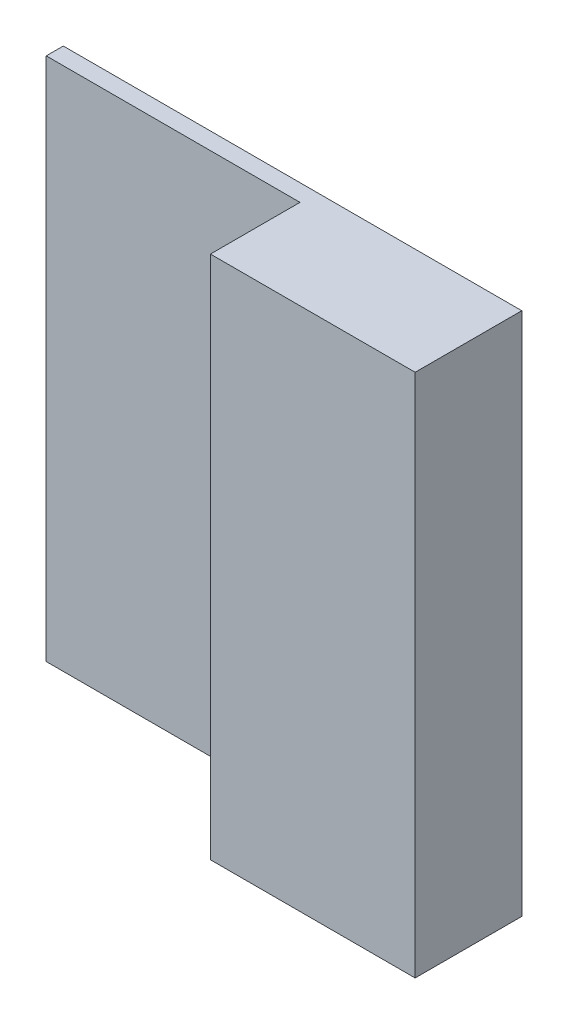
ISO-10303-21;
HEADER;
FILE_DESCRIPTION(('STEP AP214'),'2;1');
FILE_NAME('part.step','',(''),(''),'','','');
FILE_SCHEMA(('AUTOMOTIVE_DESIGN { 1 0 10303 214 1 1 1 1 }'));
ENDSEC;
DATA;
#1=APPLICATION_CONTEXT('core data for automotive mechanical design processes');
#2=APPLICATION_PROTOCOL_DEFINITION('international standard','automotive_design',2000,#1);
#3=PRODUCT_CONTEXT('',#1,'mechanical');
#4=PRODUCT('Part','Part','',(#3));
#5=PRODUCT_RELATED_PRODUCT_CATEGORY('part','',(#4));
#6=PRODUCT_DEFINITION_FORMATION('','',#4);
#7=PRODUCT_DEFINITION_CONTEXT('part definition',#1,'design');
#8=PRODUCT_DEFINITION('design','',#6,#7);
#9=PRODUCT_DEFINITION_SHAPE('','',#8);
#10=(LENGTH_UNIT() NAMED_UNIT(*) SI_UNIT(.MILLI.,.METRE.));
#11=(NAMED_UNIT(*) PLANE_ANGLE_UNIT() SI_UNIT($,.RADIAN.));
#12=(NAMED_UNIT(*) SI_UNIT($,.STERADIAN.) SOLID_ANGLE_UNIT());
#13=UNCERTAINTY_MEASURE_WITH_UNIT(LENGTH_MEASURE(1.E-05),#10,'distance_accuracy_value','');
#14=(GEOMETRIC_REPRESENTATION_CONTEXT(3) GLOBAL_UNCERTAINTY_ASSIGNED_CONTEXT((#13)) GLOBAL_UNIT_ASSIGNED_CONTEXT((#10,
#11,#12)) REPRESENTATION_CONTEXT('',''));
#15=CARTESIAN_POINT('',(0.,0.,0.));
#16=DIRECTION('',(0.,0.,1.));
#17=DIRECTION('',(1.,0.,0.));
#18=AXIS2_PLACEMENT_3D('',#15,#16,#17);
#19=CARTESIAN_POINT('',(0.,123.,-25.));
#20=DIRECTION('',(0.,0.,1.));
#21=DIRECTION('',(1.,0.,0.));
#22=AXIS2_PLACEMENT_3D('',#19,#20,#21);
#23=PLANE('',#22);
#24=DIRECTION('',(-1.,0.,0.));
#25=VECTOR('',#24,1.);
#26=CARTESIAN_POINT('',(0.,0.,-25.));
#27=LINE('',#26,#25);
#28=CARTESIAN_POINT('',(0.,0.,-25.));
#29=VERTEX_POINT('',#28);
#30=CARTESIAN_POINT('',(-107.5,0.,-25.));
#31=VERTEX_POINT('',#30);
#32=EDGE_CURVE('E119',#29,#31,#27,.T.);
#33=ORIENTED_EDGE('',*,*,#32,.T.);
#34=DIRECTION('',(0.,-1.,0.));
#35=VECTOR('',#34,1.);
#36=CARTESIAN_POINT('',(-107.5,123.,-25.));
#37=LINE('',#36,#35);
#38=CARTESIAN_POINT('',(-107.5,123.,-25.));
#39=VERTEX_POINT('',#38);
#40=EDGE_CURVE('E11',#39,#31,#37,.T.);
#41=ORIENTED_EDGE('',*,*,#40,.F.);
#42=DIRECTION('',(-1.,0.,0.));
#43=VECTOR('',#42,1.);
#44=CARTESIAN_POINT('',(0.,123.,-25.));
#45=LINE('',#44,#43);
#46=CARTESIAN_POINT('',(0.,123.,-25.));
#47=VERTEX_POINT('',#46);
#48=EDGE_CURVE('E133',#47,#39,#45,.T.);
#49=ORIENTED_EDGE('',*,*,#48,.F.);
#50=DIRECTION('',(0.,-1.,0.));
#51=VECTOR('',#50,1.);
#52=CARTESIAN_POINT('',(0.,123.,-25.));
#53=LINE('',#52,#51);
#54=EDGE_CURVE('E51',#47,#29,#53,.T.);
#55=ORIENTED_EDGE('',*,*,#54,.T.);
#56=EDGE_LOOP('',(#33,#41,#49,#55));
#57=FACE_BOUND('',#56,.T.);
#58=ADVANCED_FACE('F35',(#57),#23,.F.);
#59=CARTESIAN_POINT('',(-107.5,123.,0.));
#60=DIRECTION('',(1.,0.,0.));
#61=DIRECTION('',(0.,0.,-1.));
#62=AXIS2_PLACEMENT_3D('',#59,#60,#61);
#63=PLANE('',#62);
#64=DIRECTION('',(0.,0.,1.));
#65=VECTOR('',#64,1.);
#66=CARTESIAN_POINT('',(-107.5,0.,0.));
#67=LINE('',#66,#65);
#68=CARTESIAN_POINT('',(-107.5,0.,-21.));
#69=VERTEX_POINT('',#68);
#70=EDGE_CURVE('E121',#31,#69,#67,.T.);
#71=ORIENTED_EDGE('',*,*,#70,.T.);
#72=DIRECTION('',(0.,-1.,0.));
#73=VECTOR('',#72,1.);
#74=CARTESIAN_POINT('',(-107.5,123.,-21.));
#75=LINE('',#74,#73);
#76=CARTESIAN_POINT('',(-107.5,123.,-21.));
#77=VERTEX_POINT('',#76);
#78=EDGE_CURVE('E43',#77,#69,#75,.T.);
#79=ORIENTED_EDGE('',*,*,#78,.F.);
#80=DIRECTION('',(0.,0.,1.));
#81=VECTOR('',#80,1.);
#82=CARTESIAN_POINT('',(-107.5,123.,0.));
#83=LINE('',#82,#81);
#84=EDGE_CURVE('E83',#39,#77,#83,.T.);
#85=ORIENTED_EDGE('',*,*,#84,.F.);
#86=ORIENTED_EDGE('',*,*,#40,.T.);
#87=EDGE_LOOP('',(#71,#79,#85,#86));
#88=FACE_BOUND('',#87,.T.);
#89=ADVANCED_FACE('F139',(#88),#63,.F.);
#90=CARTESIAN_POINT('',(0.,123.,-21.));
#91=DIRECTION('',(0.,0.,1.));
#92=DIRECTION('',(1.,0.,0.));
#93=AXIS2_PLACEMENT_3D('',#90,#91,#92);
#94=PLANE('',#93);
#95=DIRECTION('',(-1.,0.,0.));
#96=VECTOR('',#95,1.);
#97=CARTESIAN_POINT('',(0.,0.,-21.));
#98=LINE('',#97,#96);
#99=CARTESIAN_POINT('',(-48.,0.,-21.));
#100=VERTEX_POINT('',#99);
#101=EDGE_CURVE('E124',#100,#69,#98,.T.);
#102=ORIENTED_EDGE('',*,*,#101,.F.);
#103=DIRECTION('',(0.,-1.,0.));
#104=VECTOR('',#103,1.);
#105=CARTESIAN_POINT('',(-48.,123.,-21.));
#106=LINE('',#105,#104);
#107=CARTESIAN_POINT('',(-48.,123.,-21.));
#108=VERTEX_POINT('',#107);
#109=EDGE_CURVE('E102',#108,#100,#106,.T.);
#110=ORIENTED_EDGE('',*,*,#109,.F.);
#111=DIRECTION('',(-1.,0.,0.));
#112=VECTOR('',#111,1.);
#113=CARTESIAN_POINT('',(0.,123.,-21.));
#114=LINE('',#113,#112);
#115=EDGE_CURVE('E111',#108,#77,#114,.T.);
#116=ORIENTED_EDGE('',*,*,#115,.T.);
#117=ORIENTED_EDGE('',*,*,#78,.T.);
#118=EDGE_LOOP('',(#102,#110,#116,#117));
#119=FACE_BOUND('',#118,.T.);
#120=ADVANCED_FACE('F138',(#119),#94,.T.);
#121=CARTESIAN_POINT('',(-48.,123.,0.));
#122=DIRECTION('',(-1.,0.,0.));
#123=DIRECTION('',(0.,0.,1.));
#124=AXIS2_PLACEMENT_3D('',#121,#122,#123);
#125=PLANE('',#124);
#126=DIRECTION('',(0.,0.,-1.));
#127=VECTOR('',#126,1.);
#128=CARTESIAN_POINT('',(-48.,0.,0.));
#129=LINE('',#128,#127);
#130=CARTESIAN_POINT('',(-48.,0.,0.));
#131=VERTEX_POINT('',#130);
#132=EDGE_CURVE('E98',#131,#100,#129,.T.);
#133=ORIENTED_EDGE('',*,*,#132,.F.);
#134=DIRECTION('',(0.,-1.,0.));
#135=VECTOR('',#134,1.);
#136=CARTESIAN_POINT('',(-48.,123.,0.));
#137=LINE('',#136,#135);
#138=CARTESIAN_POINT('',(-48.,123.,0.));
#139=VERTEX_POINT('',#138);
#140=EDGE_CURVE('E93',#139,#131,#137,.T.);
#141=ORIENTED_EDGE('',*,*,#140,.F.);
#142=DIRECTION('',(0.,0.,-1.));
#143=VECTOR('',#142,1.);
#144=CARTESIAN_POINT('',(-48.,123.,0.));
#145=LINE('',#144,#143);
#146=EDGE_CURVE('E96',#139,#108,#145,.T.);
#147=ORIENTED_EDGE('',*,*,#146,.T.);
#148=ORIENTED_EDGE('',*,*,#109,.T.);
#149=EDGE_LOOP('',(#133,#141,#147,#148));
#150=FACE_BOUND('',#149,.T.);
#151=ADVANCED_FACE('F95',(#150),#125,.T.);
#152=CARTESIAN_POINT('',(0.,123.,0.));
#153=DIRECTION('',(0.,0.,1.));
#154=DIRECTION('',(1.,0.,0.));
#155=AXIS2_PLACEMENT_3D('',#152,#153,#154);
#156=PLANE('',#155);
#157=DIRECTION('',(-1.,0.,0.));
#158=VECTOR('',#157,1.);
#159=CARTESIAN_POINT('',(0.,0.,0.));
#160=LINE('',#159,#158);
#161=CARTESIAN_POINT('',(0.,0.,0.));
#162=VERTEX_POINT('',#161);
#163=EDGE_CURVE('E128',#162,#131,#160,.T.);
#164=ORIENTED_EDGE('',*,*,#163,.F.);
#165=DIRECTION('',(0.,-1.,0.));
#166=VECTOR('',#165,1.);
#167=CARTESIAN_POINT('',(0.,123.,0.));
#168=LINE('',#167,#166);
#169=CARTESIAN_POINT('',(0.,123.,0.));
#170=VERTEX_POINT('',#169);
#171=EDGE_CURVE('E71',#170,#162,#168,.T.);
#172=ORIENTED_EDGE('',*,*,#171,.F.);
#173=DIRECTION('',(-1.,0.,0.));
#174=VECTOR('',#173,1.);
#175=CARTESIAN_POINT('',(0.,123.,0.));
#176=LINE('',#175,#174);
#177=EDGE_CURVE('E109',#170,#139,#176,.T.);
#178=ORIENTED_EDGE('',*,*,#177,.T.);
#179=ORIENTED_EDGE('',*,*,#140,.T.);
#180=EDGE_LOOP('',(#164,#172,#178,#179));
#181=FACE_BOUND('',#180,.T.);
#182=ADVANCED_FACE('F113',(#181),#156,.T.);
#183=CARTESIAN_POINT('',(0.,123.,0.));
#184=DIRECTION('',(1.,0.,0.));
#185=DIRECTION('',(0.,0.,-1.));
#186=AXIS2_PLACEMENT_3D('',#183,#184,#185);
#187=PLANE('',#186);
#188=DIRECTION('',(0.,0.,1.));
#189=VECTOR('',#188,1.);
#190=CARTESIAN_POINT('',(0.,0.,0.));
#191=LINE('',#190,#189);
#192=EDGE_CURVE('E130',#29,#162,#191,.T.);
#193=ORIENTED_EDGE('',*,*,#192,.F.);
#194=ORIENTED_EDGE('',*,*,#54,.F.);
#195=DIRECTION('',(0.,0.,1.));
#196=VECTOR('',#195,1.);
#197=CARTESIAN_POINT('',(0.,123.,0.));
#198=LINE('',#197,#196);
#199=EDGE_CURVE('E114',#47,#170,#198,.T.);
#200=ORIENTED_EDGE('',*,*,#199,.T.);
#201=ORIENTED_EDGE('',*,*,#171,.T.);
#202=EDGE_LOOP('',(#193,#194,#200,#201));
#203=FACE_BOUND('',#202,.T.);
#204=ADVANCED_FACE('F143',(#203),#187,.T.);
#205=CARTESIAN_POINT('',(0.,123.,0.));
#206=DIRECTION('',(0.,1.,0.));
#207=DIRECTION('',(0.,0.,1.));
#208=AXIS2_PLACEMENT_3D('',#205,#206,#207);
#209=PLANE('',#208);
#210=ORIENTED_EDGE('',*,*,#48,.T.);
#211=ORIENTED_EDGE('',*,*,#84,.T.);
#212=ORIENTED_EDGE('',*,*,#115,.F.);
#213=ORIENTED_EDGE('',*,*,#146,.F.);
#214=ORIENTED_EDGE('',*,*,#177,.F.);
#215=ORIENTED_EDGE('',*,*,#199,.F.);
#216=EDGE_LOOP('',(#210,#211,#212,#213,#214,#215));
#217=FACE_BOUND('',#216,.T.);
#218=ADVANCED_FACE('F107',(#217),#209,.T.);
#219=CARTESIAN_POINT('',(0.,0.,0.));
#220=DIRECTION('',(0.,1.,0.));
#221=DIRECTION('',(0.,0.,1.));
#222=AXIS2_PLACEMENT_3D('',#219,#220,#221);
#223=PLANE('',#222);
#224=ORIENTED_EDGE('',*,*,#32,.F.);
#225=ORIENTED_EDGE('',*,*,#192,.T.);
#226=ORIENTED_EDGE('',*,*,#163,.T.);
#227=ORIENTED_EDGE('',*,*,#132,.T.);
#228=ORIENTED_EDGE('',*,*,#101,.T.);
#229=ORIENTED_EDGE('',*,*,#70,.F.);
#230=EDGE_LOOP('',(#224,#225,#226,#227,#228,#229));
#231=FACE_BOUND('',#230,.T.);
#232=ADVANCED_FACE('F142',(#231),#223,.F.);
#233=CLOSED_SHELL('',(#58,#89,#120,#151,#182,#204,#218,#232));
#234=MANIFOLD_SOLID_BREP('B2',#233);
#235=ADVANCED_BREP_SHAPE_REPRESENTATION('',(#18,#234),#14);
#236=SHAPE_DEFINITION_REPRESENTATION(#9,#235);
ENDSEC;
END-ISO-10303-21;
